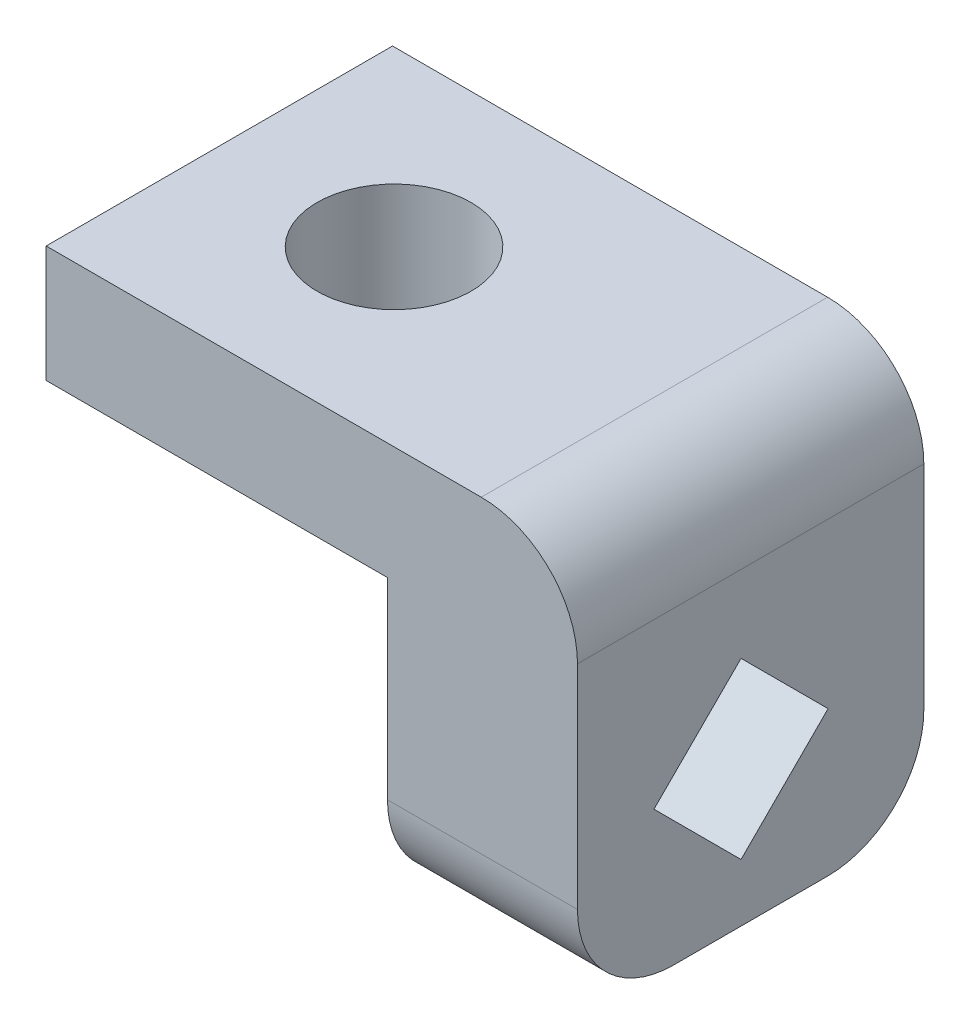
ISO-10303-21;
HEADER;
FILE_DESCRIPTION(('STEP AP214'),'2;1');
FILE_NAME('part.step','',(''),(''),'','','');
FILE_SCHEMA(('AUTOMOTIVE_DESIGN { 1 0 10303 214 1 1 1 1 }'));
ENDSEC;
DATA;
#1=APPLICATION_CONTEXT('core data for automotive mechanical design processes');
#2=APPLICATION_PROTOCOL_DEFINITION('international standard','automotive_design',2000,#1);
#3=PRODUCT_CONTEXT('',#1,'mechanical');
#4=PRODUCT('Part','Part','',(#3));
#5=PRODUCT_RELATED_PRODUCT_CATEGORY('part','',(#4));
#6=PRODUCT_DEFINITION_FORMATION('','',#4);
#7=PRODUCT_DEFINITION_CONTEXT('part definition',#1,'design');
#8=PRODUCT_DEFINITION('design','',#6,#7);
#9=PRODUCT_DEFINITION_SHAPE('','',#8);
#10=(LENGTH_UNIT() NAMED_UNIT(*) SI_UNIT(.MILLI.,.METRE.));
#11=(NAMED_UNIT(*) PLANE_ANGLE_UNIT() SI_UNIT($,.RADIAN.));
#12=(NAMED_UNIT(*) SI_UNIT($,.STERADIAN.) SOLID_ANGLE_UNIT());
#13=UNCERTAINTY_MEASURE_WITH_UNIT(LENGTH_MEASURE(1.E-05),#10,'distance_accuracy_value','');
#14=(GEOMETRIC_REPRESENTATION_CONTEXT(3) GLOBAL_UNCERTAINTY_ASSIGNED_CONTEXT((#13)) GLOBAL_UNIT_ASSIGNED_CONTEXT((#10,
#11,#12)) REPRESENTATION_CONTEXT('',''));
#15=CARTESIAN_POINT('',(0.,0.,0.));
#16=DIRECTION('',(0.,0.,1.));
#17=DIRECTION('',(1.,0.,0.));
#18=AXIS2_PLACEMENT_3D('',#15,#16,#17);
#19=CARTESIAN_POINT('',(0.,0.,-8.99999961256981));
#20=DIRECTION('',(0.,0.,-1.));
#21=DIRECTION('',(-1.,0.,0.));
#22=AXIS2_PLACEMENT_3D('',#19,#20,#21);
#23=PLANE('',#22);
#24=DIRECTION('',(0.,1.,0.));
#25=VECTOR('',#24,1.);
#26=CARTESIAN_POINT('',(4.93649998679757,18.9999993890524,-8.99999961256981));
#27=LINE('',#26,#25);
#28=CARTESIAN_POINT('',(4.93649998679757,23.9999993890524,-8.99999961256981));
#29=VERTEX_POINT('',#28);
#30=CARTESIAN_POINT('',(4.93649998679757,35.0550615325178,-8.99999961256981));
#31=VERTEX_POINT('',#30);
#32=EDGE_CURVE('E209',#29,#31,#27,.T.);
#33=ORIENTED_EDGE('',*,*,#32,.F.);
#34=DIRECTION('',(-1.,0.,0.));
#35=VECTOR('',#34,1.);
#36=CARTESIAN_POINT('',(0.,23.9999993890524,-8.99999961256981));
#37=LINE('',#36,#35);
#38=CARTESIAN_POINT('',(-4.93649998679757,23.9999993890524,-8.99999961256981));
#39=VERTEX_POINT('',#38);
#40=EDGE_CURVE('E12',#29,#39,#37,.T.);
#41=ORIENTED_EDGE('',*,*,#40,.T.);
#42=DIRECTION('',(0.,-1.,0.));
#43=VECTOR('',#42,1.);
#44=CARTESIAN_POINT('',(-4.93649998679757,37.0000004768372,-8.99999961256981));
#45=LINE('',#44,#43);
#46=CARTESIAN_POINT('',(-4.93649998679757,34.0000004768372,-8.99999961256981));
#47=VERTEX_POINT('',#46);
#48=EDGE_CURVE('E172',#47,#39,#45,.T.);
#49=ORIENTED_EDGE('',*,*,#48,.F.);
#50=DIRECTION('',(1.,0.,0.));
#51=VECTOR('',#50,1.);
#52=CARTESIAN_POINT('',(-22.6750001311302,34.0000004768372,-8.99999961256981));
#53=LINE('',#52,#51);
#54=CARTESIAN_POINT('',(-22.6750001311302,34.0000004768372,-8.99999961256981));
#55=VERTEX_POINT('',#54);
#56=EDGE_CURVE('E170',#55,#47,#53,.T.);
#57=ORIENTED_EDGE('',*,*,#56,.F.);
#58=DIRECTION('',(0.,1.,0.));
#59=VECTOR('',#58,1.);
#60=CARTESIAN_POINT('',(-22.6750001311302,37.0000004768372,-8.99999961256981));
#61=LINE('',#60,#59);
#62=CARTESIAN_POINT('',(-22.6750001311302,40.0550615325178,-8.99999961256981));
#63=VERTEX_POINT('',#62);
#64=EDGE_CURVE('E154',#55,#63,#61,.T.);
#65=ORIENTED_EDGE('',*,*,#64,.T.);
#66=DIRECTION('',(-1.,0.,0.));
#67=VECTOR('',#66,1.);
#68=CARTESIAN_POINT('',(0.,40.0550615325178,-8.99999961256981));
#69=LINE('',#68,#67);
#70=CARTESIAN_POINT('',(-0.0635000132024333,40.0550615325178,-8.99999961256981));
#71=VERTEX_POINT('',#70);
#72=EDGE_CURVE('E191',#71,#63,#69,.T.);
#73=ORIENTED_EDGE('',*,*,#72,.F.);
#74=CARTESIAN_POINT('',(-0.0635000132024333,35.0550615325178,-8.99999961256981));
#75=DIRECTION('',(0.,0.,-1.));
#76=DIRECTION('',(-1.,0.,0.));
#77=AXIS2_PLACEMENT_3D('',#74,#75,#76);
#78=CIRCLE('',#77,5.);
#79=EDGE_CURVE('E243',#71,#31,#78,.T.);
#80=ORIENTED_EDGE('',*,*,#79,.T.);
#81=EDGE_LOOP('',(#33,#41,#49,#57,#65,#73,#80));
#82=FACE_BOUND('',#81,.T.);
#83=ADVANCED_FACE('F58',(#82),#23,.T.);
#84=CARTESIAN_POINT('',(4.93649998679757,18.9999993890524,8.99999961256981));
#85=DIRECTION('',(-1.,0.,0.));
#86=DIRECTION('',(0.,0.,1.));
#87=AXIS2_PLACEMENT_3D('',#84,#85,#86);
#88=PLANE('',#87);
#89=DIRECTION('',(0.,0.707106703879505,0.707106858493582));
#90=VECTOR('',#89,1.);
#91=CARTESIAN_POINT('',(4.93649998679757,24.749999757318,3.25000050158373));
#92=LINE('',#91,#90);
#93=CARTESIAN_POINT('',(4.93649998679758,21.9999998807907,0.500000023748726));
#94=VERTEX_POINT('',#93);
#95=CARTESIAN_POINT('',(4.93649998679758,26.5254824771547,5.02548360964273));
#96=VERTEX_POINT('',#95);
#97=EDGE_CURVE('E232',#94,#96,#92,.T.);
#98=ORIENTED_EDGE('',*,*,#97,.T.);
#99=DIRECTION('',(0.,0.707106858493582,-0.707106703879504));
#100=VECTOR('',#99,1.);
#101=CARTESIAN_POINT('',(4.93649998679757,20.775482108889,10.7754827206288));
#102=LINE('',#101,#100);
#103=CARTESIAN_POINT('',(4.93649998679758,31.0509669943714,0.500000081956279));
#104=VERTEX_POINT('',#103);
#105=EDGE_CURVE('E235',#96,#104,#102,.T.);
#106=ORIENTED_EDGE('',*,*,#105,.T.);
#107=DIRECTION('',(0.,-0.707106703879504,-0.707106858493582));
#108=VECTOR('',#107,1.);
#109=CARTESIAN_POINT('',(4.93649998679757,29.2754842745347,-1.27548302610271));
#110=LINE('',#109,#108);
#111=CARTESIAN_POINT('',(4.93649998679757,26.5254843980074,-4.02548350393772));
#112=VERTEX_POINT('',#111);
#113=EDGE_CURVE('E166',#104,#112,#110,.T.);
#114=ORIENTED_EDGE('',*,*,#113,.T.);
#115=DIRECTION('',(0.,-0.707106858493582,0.707106703879504));
#116=VECTOR('',#115,1.);
#117=CARTESIAN_POINT('',(4.93649998679757,16.2499995125251,6.2499991347348));
#118=LINE('',#117,#116);
#119=EDGE_CURVE('E229',#112,#94,#118,.T.);
#120=ORIENTED_EDGE('',*,*,#119,.T.);
#121=EDGE_LOOP('',(#98,#106,#114,#120));
#122=FACE_BOUND('',#121,.T.);
#123=DIRECTION('',(0.,1.,0.));
#124=VECTOR('',#123,1.);
#125=CARTESIAN_POINT('',(4.93649998679757,18.9999993890524,8.99999961256981));
#126=LINE('',#125,#124);
#127=CARTESIAN_POINT('',(4.93649998679757,23.9999993890524,8.99999961256981));
#128=VERTEX_POINT('',#127);
#129=CARTESIAN_POINT('',(4.93649998679757,35.0550615325178,8.99999961256981));
#130=VERTEX_POINT('',#129);
#131=EDGE_CURVE('E216',#128,#130,#126,.T.);
#132=ORIENTED_EDGE('',*,*,#131,.F.);
#133=CARTESIAN_POINT('',(4.93649998679757,23.9999993890524,3.99999961256981));
#134=DIRECTION('',(-1.,0.,0.));
#135=DIRECTION('',(0.,0.,1.));
#136=AXIS2_PLACEMENT_3D('',#133,#134,#135);
#137=CIRCLE('',#136,5.);
#138=CARTESIAN_POINT('',(4.93649998679757,18.9999993890524,3.99999961256981));
#139=VERTEX_POINT('',#138);
#140=EDGE_CURVE('E256',#128,#139,#137,.F.);
#141=ORIENTED_EDGE('',*,*,#140,.T.);
#142=DIRECTION('',(0.,0.,-1.));
#143=VECTOR('',#142,1.);
#144=CARTESIAN_POINT('',(4.93649998679757,18.9999993890524,8.99999961256981));
#145=LINE('',#144,#143);
#146=CARTESIAN_POINT('',(4.93649998679757,18.9999993890524,-3.99999961256981));
#147=VERTEX_POINT('',#146);
#148=EDGE_CURVE('E218',#139,#147,#145,.T.);
#149=ORIENTED_EDGE('',*,*,#148,.T.);
#150=CARTESIAN_POINT('',(4.93649998679757,23.9999993890524,-3.99999961256981));
#151=DIRECTION('',(-1.,0.,0.));
#152=DIRECTION('',(0.,0.,1.));
#153=AXIS2_PLACEMENT_3D('',#150,#151,#152);
#154=CIRCLE('',#153,5.);
#155=EDGE_CURVE('E254',#147,#29,#154,.F.);
#156=ORIENTED_EDGE('',*,*,#155,.T.);
#157=ORIENTED_EDGE('',*,*,#32,.T.);
#158=DIRECTION('',(0.,0.,-1.));
#159=VECTOR('',#158,1.);
#160=CARTESIAN_POINT('',(4.93649998679757,35.0550615325178,8.99999961256981));
#161=LINE('',#160,#159);
#162=EDGE_CURVE('E246',#31,#130,#161,.F.);
#163=ORIENTED_EDGE('',*,*,#162,.T.);
#164=EDGE_LOOP('',(#132,#141,#149,#156,#157,#163));
#165=FACE_BOUND('',#164,.T.);
#166=ADVANCED_FACE('F274',(#122,#165),#88,.F.);
#167=CARTESIAN_POINT('',(0.,0.,8.99999961256981));
#168=DIRECTION('',(0.,0.,-1.));
#169=DIRECTION('',(-1.,0.,0.));
#170=AXIS2_PLACEMENT_3D('',#167,#168,#169);
#171=PLANE('',#170);
#172=DIRECTION('',(0.,-1.,0.));
#173=VECTOR('',#172,1.);
#174=CARTESIAN_POINT('',(-4.93649998679757,37.0000004768372,8.99999961256981));
#175=LINE('',#174,#173);
#176=CARTESIAN_POINT('',(-4.93649998679757,34.0000004768372,8.99999961256981));
#177=VERTEX_POINT('',#176);
#178=CARTESIAN_POINT('',(-4.93649998679757,23.9999993890524,8.99999961256981));
#179=VERTEX_POINT('',#178);
#180=EDGE_CURVE('E222',#177,#179,#175,.T.);
#181=ORIENTED_EDGE('',*,*,#180,.T.);
#182=DIRECTION('',(1.,0.,0.));
#183=VECTOR('',#182,1.);
#184=CARTESIAN_POINT('',(4.93649998679757,23.9999993890524,8.99999961256981));
#185=LINE('',#184,#183);
#186=EDGE_CURVE('E251',#179,#128,#185,.T.);
#187=ORIENTED_EDGE('',*,*,#186,.T.);
#188=ORIENTED_EDGE('',*,*,#131,.T.);
#189=CARTESIAN_POINT('',(-0.0635000132024333,35.0550615325178,8.99999961256981));
#190=DIRECTION('',(0.,0.,-1.));
#191=DIRECTION('',(-1.,0.,0.));
#192=AXIS2_PLACEMENT_3D('',#189,#190,#191);
#193=CIRCLE('',#192,5.);
#194=CARTESIAN_POINT('',(-0.0635000132024333,40.0550615325178,8.99999961256981));
#195=VERTEX_POINT('',#194);
#196=EDGE_CURVE('E249',#130,#195,#193,.F.);
#197=ORIENTED_EDGE('',*,*,#196,.T.);
#198=DIRECTION('',(-1.,0.,0.));
#199=VECTOR('',#198,1.);
#200=CARTESIAN_POINT('',(0.,40.0550615325178,8.99999961256981));
#201=LINE('',#200,#199);
#202=CARTESIAN_POINT('',(-22.6750001311302,40.0550615325178,8.99999961256981));
#203=VERTEX_POINT('',#202);
#204=EDGE_CURVE('E238',#195,#203,#201,.T.);
#205=ORIENTED_EDGE('',*,*,#204,.T.);
#206=DIRECTION('',(0.,-1.,0.));
#207=VECTOR('',#206,1.);
#208=CARTESIAN_POINT('',(-22.6750001311302,0.,8.99999961256981));
#209=LINE('',#208,#207);
#210=CARTESIAN_POINT('',(-22.6750001311302,34.0000004768372,8.99999961256981));
#211=VERTEX_POINT('',#210);
#212=EDGE_CURVE('E193',#203,#211,#209,.T.);
#213=ORIENTED_EDGE('',*,*,#212,.T.);
#214=DIRECTION('',(-1.,0.,0.));
#215=VECTOR('',#214,1.);
#216=CARTESIAN_POINT('',(-4.93649998679757,34.0000004768372,8.99999961256981));
#217=LINE('',#216,#215);
#218=EDGE_CURVE('E179',#177,#211,#217,.T.);
#219=ORIENTED_EDGE('',*,*,#218,.F.);
#220=EDGE_LOOP('',(#181,#187,#188,#197,#205,#213,#219));
#221=FACE_BOUND('',#220,.T.);
#222=ADVANCED_FACE('F269',(#221),#171,.F.);
#223=CARTESIAN_POINT('',(118.674999475479,40.0550615325178,-22.8594064091749));
#224=DIRECTION('',(0.,-1.,0.));
#225=DIRECTION('',(0.,0.,-1.));
#226=AXIS2_PLACEMENT_3D('',#223,#224,#225);
#227=PLANE('',#226);
#228=CARTESIAN_POINT('',(-13.5955331401277,40.0550615325178,0.));
#229=DIRECTION('',(0.,-1.,0.));
#230=DIRECTION('',(0.,0.,-1.));
#231=AXIS2_PLACEMENT_3D('',#228,#229,#230);
#232=CIRCLE('',#231,4.);
#233=CARTESIAN_POINT('',(-13.5955331401277,40.0550615325178,-4.));
#234=VERTEX_POINT('',#233);
#235=EDGE_CURVE('E187',#234,#234,#232,.T.);
#236=ORIENTED_EDGE('',*,*,#235,.T.);
#237=EDGE_LOOP('',(#236));
#238=FACE_BOUND('',#237,.T.);
#239=ORIENTED_EDGE('',*,*,#204,.F.);
#240=DIRECTION('',(0.,0.,-1.));
#241=VECTOR('',#240,1.);
#242=CARTESIAN_POINT('',(-0.0635000132024333,40.0550615325178,-22.8594064091749));
#243=LINE('',#242,#241);
#244=EDGE_CURVE('E240',#195,#71,#243,.T.);
#245=ORIENTED_EDGE('',*,*,#244,.T.);
#246=ORIENTED_EDGE('',*,*,#72,.T.);
#247=DIRECTION('',(0.,0.,1.));
#248=VECTOR('',#247,1.);
#249=CARTESIAN_POINT('',(-22.6750001311302,40.0550615325178,0.));
#250=LINE('',#249,#248);
#251=EDGE_CURVE('E162',#63,#203,#250,.T.);
#252=ORIENTED_EDGE('',*,*,#251,.T.);
#253=EDGE_LOOP('',(#239,#245,#246,#252));
#254=FACE_BOUND('',#253,.T.);
#255=ADVANCED_FACE('F285',(#238,#254),#227,.F.);
#256=CARTESIAN_POINT('',(-22.6750001311302,0.,0.));
#257=DIRECTION('',(-1.,0.,0.));
#258=DIRECTION('',(0.,0.,1.));
#259=AXIS2_PLACEMENT_3D('',#256,#257,#258);
#260=PLANE('',#259);
#261=ORIENTED_EDGE('',*,*,#251,.F.);
#262=ORIENTED_EDGE('',*,*,#64,.F.);
#263=DIRECTION('',(0.,0.,-1.));
#264=VECTOR('',#263,1.);
#265=CARTESIAN_POINT('',(-22.6750001311302,34.0000004768372,8.99999961256981));
#266=LINE('',#265,#264);
#267=EDGE_CURVE('E159',#211,#55,#266,.T.);
#268=ORIENTED_EDGE('',*,*,#267,.F.);
#269=ORIENTED_EDGE('',*,*,#212,.F.);
#270=EDGE_LOOP('',(#261,#262,#268,#269));
#271=FACE_BOUND('',#270,.T.);
#272=ADVANCED_FACE('F156',(#271),#260,.T.);
#273=CARTESIAN_POINT('',(0.,18.9999993890524,0.));
#274=DIRECTION('',(0.,-1.,0.));
#275=DIRECTION('',(0.,0.,-1.));
#276=AXIS2_PLACEMENT_3D('',#273,#274,#275);
#277=PLANE('',#276);
#278=ORIENTED_EDGE('',*,*,#148,.F.);
#279=DIRECTION('',(1.,0.,0.));
#280=VECTOR('',#279,1.);
#281=CARTESIAN_POINT('',(-4.93649998679757,18.9999993890524,3.99999961256981));
#282=LINE('',#281,#280);
#283=CARTESIAN_POINT('',(-4.93649998679757,18.9999993890524,3.99999961256981));
#284=VERTEX_POINT('',#283);
#285=EDGE_CURVE('E260',#139,#284,#282,.F.);
#286=ORIENTED_EDGE('',*,*,#285,.T.);
#287=DIRECTION('',(0.,0.,-1.));
#288=VECTOR('',#287,1.);
#289=CARTESIAN_POINT('',(-4.93649998679757,18.9999993890524,8.99999961256981));
#290=LINE('',#289,#288);
#291=CARTESIAN_POINT('',(-4.93649998679757,18.9999993890524,-3.99999961256981));
#292=VERTEX_POINT('',#291);
#293=EDGE_CURVE('E167',#284,#292,#290,.T.);
#294=ORIENTED_EDGE('',*,*,#293,.T.);
#295=DIRECTION('',(-1.,0.,0.));
#296=VECTOR('',#295,1.);
#297=CARTESIAN_POINT('',(0.,18.9999993890524,-3.99999961256981));
#298=LINE('',#297,#296);
#299=EDGE_CURVE('E258',#292,#147,#298,.F.);
#300=ORIENTED_EDGE('',*,*,#299,.T.);
#301=EDGE_LOOP('',(#278,#286,#294,#300));
#302=FACE_BOUND('',#301,.T.);
#303=ADVANCED_FACE('F277',(#302),#277,.T.);
#304=CARTESIAN_POINT('',(-4.93649998679757,37.0000004768372,8.99999961256981));
#305=DIRECTION('',(1.,0.,0.));
#306=DIRECTION('',(0.,1.,0.));
#307=AXIS2_PLACEMENT_3D('',#304,#305,#306);
#308=PLANE('',#307);
#309=DIRECTION('',(0.,-0.707106703879504,-0.707106858493582));
#310=VECTOR('',#309,1.);
#311=CARTESIAN_POINT('',(-4.93649998679757,31.0509669943714,0.500000081956279));
#312=LINE('',#311,#310);
#313=CARTESIAN_POINT('',(-4.93649998679757,31.0509669943714,0.500000081956278));
#314=VERTEX_POINT('',#313);
#315=CARTESIAN_POINT('',(-4.93649998679757,26.5254843980074,-4.02548350393772));
#316=VERTEX_POINT('',#315);
#317=EDGE_CURVE('E197',#314,#316,#312,.T.);
#318=ORIENTED_EDGE('',*,*,#317,.F.);
#319=DIRECTION('',(0.,0.707106858493582,-0.707106703879504));
#320=VECTOR('',#319,1.);
#321=CARTESIAN_POINT('',(-4.93649998679757,26.5254824771547,5.02548360964273));
#322=LINE('',#321,#320);
#323=CARTESIAN_POINT('',(-4.93649998679757,26.5254824771547,5.02548360964273));
#324=VERTEX_POINT('',#323);
#325=EDGE_CURVE('E195',#324,#314,#322,.T.);
#326=ORIENTED_EDGE('',*,*,#325,.F.);
#327=DIRECTION('',(0.,0.707106703879504,0.707106858493582));
#328=VECTOR('',#327,1.);
#329=CARTESIAN_POINT('',(-4.93649998679757,21.9999998807907,0.500000023748726));
#330=LINE('',#329,#328);
#331=CARTESIAN_POINT('',(-4.93649998679757,21.9999998807907,0.500000023748726));
#332=VERTEX_POINT('',#331);
#333=EDGE_CURVE('E203',#332,#324,#330,.T.);
#334=ORIENTED_EDGE('',*,*,#333,.F.);
#335=DIRECTION('',(0.,-0.707106858493582,0.707106703879504));
#336=VECTOR('',#335,1.);
#337=CARTESIAN_POINT('',(-4.93649998679757,26.5254843980074,-4.02548350393772));
#338=LINE('',#337,#336);
#339=EDGE_CURVE('E200',#316,#332,#338,.T.);
#340=ORIENTED_EDGE('',*,*,#339,.F.);
#341=EDGE_LOOP('',(#318,#326,#334,#340));
#342=FACE_BOUND('',#341,.T.);
#343=ORIENTED_EDGE('',*,*,#293,.F.);
#344=CARTESIAN_POINT('',(-4.93649998679757,23.9999993890524,3.99999961256981));
#345=DIRECTION('',(1.,0.,0.));
#346=DIRECTION('',(0.,1.,0.));
#347=AXIS2_PLACEMENT_3D('',#344,#345,#346);
#348=CIRCLE('',#347,5.);
#349=EDGE_CURVE('E66',#284,#179,#348,.F.);
#350=ORIENTED_EDGE('',*,*,#349,.T.);
#351=ORIENTED_EDGE('',*,*,#180,.F.);
#352=DIRECTION('',(0.,0.,1.));
#353=VECTOR('',#352,1.);
#354=CARTESIAN_POINT('',(-4.93649998679757,34.0000004768372,-8.99999961256981));
#355=LINE('',#354,#353);
#356=EDGE_CURVE('E175',#47,#177,#355,.T.);
#357=ORIENTED_EDGE('',*,*,#356,.F.);
#358=ORIENTED_EDGE('',*,*,#48,.T.);
#359=CARTESIAN_POINT('',(-4.93649998679757,23.9999993890524,-3.99999961256981));
#360=DIRECTION('',(1.,0.,0.));
#361=DIRECTION('',(0.,1.,0.));
#362=AXIS2_PLACEMENT_3D('',#359,#360,#361);
#363=CIRCLE('',#362,5.);
#364=EDGE_CURVE('E73',#39,#292,#363,.F.);
#365=ORIENTED_EDGE('',*,*,#364,.T.);
#366=EDGE_LOOP('',(#343,#350,#351,#357,#358,#365));
#367=FACE_BOUND('',#366,.T.);
#368=ADVANCED_FACE('F264',(#342,#367),#308,.F.);
#369=CARTESIAN_POINT('',(22.6750001311302,26.5254824771547,5.02548360964273));
#370=DIRECTION('',(0.,0.707106703879504,0.707106858493582));
#371=DIRECTION('',(0.,-0.707106858493582,0.707106703879504));
#372=AXIS2_PLACEMENT_3D('',#369,#370,#371);
#373=PLANE('',#372);
#374=DIRECTION('',(-1.,0.,0.));
#375=VECTOR('',#374,1.);
#376=CARTESIAN_POINT('',(22.6750001311302,26.5254824771547,5.02548360964273));
#377=LINE('',#376,#375);
#378=EDGE_CURVE('E207',#96,#324,#377,.T.);
#379=ORIENTED_EDGE('',*,*,#378,.T.);
#380=ORIENTED_EDGE('',*,*,#325,.T.);
#381=DIRECTION('',(-1.,0.,0.));
#382=VECTOR('',#381,1.);
#383=CARTESIAN_POINT('',(22.6750001311302,31.0509669943714,0.500000081956279));
#384=LINE('',#383,#382);
#385=EDGE_CURVE('E206',#104,#314,#384,.T.);
#386=ORIENTED_EDGE('',*,*,#385,.F.);
#387=ORIENTED_EDGE('',*,*,#105,.F.);
#388=EDGE_LOOP('',(#379,#380,#386,#387));
#389=FACE_BOUND('',#388,.T.);
#390=ADVANCED_FACE('F372',(#389),#373,.F.);
#391=CARTESIAN_POINT('',(22.6750001311302,21.9999998807907,0.500000023748726));
#392=DIRECTION('',(0.,-0.707106858493582,0.707106703879504));
#393=DIRECTION('',(0.,-0.707106703879505,-0.707106858493582));
#394=AXIS2_PLACEMENT_3D('',#391,#392,#393);
#395=PLANE('',#394);
#396=DIRECTION('',(-1.,0.,0.));
#397=VECTOR('',#396,1.);
#398=CARTESIAN_POINT('',(22.6750001311302,21.9999998807907,0.500000023748726));
#399=LINE('',#398,#397);
#400=EDGE_CURVE('E210',#94,#332,#399,.T.);
#401=ORIENTED_EDGE('',*,*,#400,.T.);
#402=ORIENTED_EDGE('',*,*,#333,.T.);
#403=ORIENTED_EDGE('',*,*,#378,.F.);
#404=ORIENTED_EDGE('',*,*,#97,.F.);
#405=EDGE_LOOP('',(#401,#402,#403,#404));
#406=FACE_BOUND('',#405,.T.);
#407=ADVANCED_FACE('F385',(#406),#395,.F.);
#408=CARTESIAN_POINT('',(22.6750001311302,26.5254843980074,-4.02548350393772));
#409=DIRECTION('',(0.,-0.707106703879504,-0.707106858493582));
#410=DIRECTION('',(0.,0.707106858493582,-0.707106703879504));
#411=AXIS2_PLACEMENT_3D('',#408,#409,#410);
#412=PLANE('',#411);
#413=DIRECTION('',(-1.,0.,0.));
#414=VECTOR('',#413,1.);
#415=CARTESIAN_POINT('',(22.6750001311302,26.5254843980074,-4.02548350393772));
#416=LINE('',#415,#414);
#417=EDGE_CURVE('E212',#112,#316,#416,.T.);
#418=ORIENTED_EDGE('',*,*,#417,.T.);
#419=ORIENTED_EDGE('',*,*,#339,.T.);
#420=ORIENTED_EDGE('',*,*,#400,.F.);
#421=ORIENTED_EDGE('',*,*,#119,.F.);
#422=EDGE_LOOP('',(#418,#419,#420,#421));
#423=FACE_BOUND('',#422,.T.);
#424=ADVANCED_FACE('F395',(#423),#412,.F.);
#425=CARTESIAN_POINT('',(22.6750001311302,31.0509669943714,0.500000081956279));
#426=DIRECTION('',(0.,0.707106858493582,-0.707106703879504));
#427=DIRECTION('',(0.,0.707106703879504,0.707106858493582));
#428=AXIS2_PLACEMENT_3D('',#425,#426,#427);
#429=PLANE('',#428);
#430=ORIENTED_EDGE('',*,*,#385,.T.);
#431=ORIENTED_EDGE('',*,*,#317,.T.);
#432=ORIENTED_EDGE('',*,*,#417,.F.);
#433=ORIENTED_EDGE('',*,*,#113,.F.);
#434=EDGE_LOOP('',(#430,#431,#432,#433));
#435=FACE_BOUND('',#434,.T.);
#436=ADVANCED_FACE('F405',(#435),#429,.F.);
#437=CARTESIAN_POINT('',(-13.5955331401277,50.0000004768372,0.));
#438=DIRECTION('',(0.,-1.,0.));
#439=DIRECTION('',(0.,0.,-1.));
#440=AXIS2_PLACEMENT_3D('',#437,#438,#439);
#441=CYLINDRICAL_SURFACE('',#440,4.);
#442=ORIENTED_EDGE('',*,*,#235,.F.);
#443=EDGE_LOOP('',(#442));
#444=FACE_BOUND('',#443,.T.);
#445=CARTESIAN_POINT('',(-13.5955331401277,34.0000004768372,0.));
#446=DIRECTION('',(0.,-1.,0.));
#447=DIRECTION('',(0.,0.,-1.));
#448=AXIS2_PLACEMENT_3D('',#445,#446,#447);
#449=CIRCLE('',#448,4.);
#450=CARTESIAN_POINT('',(-13.5955331401277,34.0000004768372,-4.));
#451=VERTEX_POINT('',#450);
#452=EDGE_CURVE('E180',#451,#451,#449,.T.);
#453=ORIENTED_EDGE('',*,*,#452,.T.);
#454=EDGE_LOOP('',(#453));
#455=FACE_BOUND('',#454,.T.);
#456=ADVANCED_FACE('F415',(#444,#455),#441,.F.);
#457=CARTESIAN_POINT('',(0.,34.0000004768372,0.));
#458=DIRECTION('',(0.,-1.,0.));
#459=DIRECTION('',(0.,0.,-1.));
#460=AXIS2_PLACEMENT_3D('',#457,#458,#459);
#461=PLANE('',#460);
#462=ORIENTED_EDGE('',*,*,#452,.F.);
#463=EDGE_LOOP('',(#462));
#464=FACE_BOUND('',#463,.T.);
#465=ORIENTED_EDGE('',*,*,#267,.T.);
#466=ORIENTED_EDGE('',*,*,#56,.T.);
#467=ORIENTED_EDGE('',*,*,#356,.T.);
#468=ORIENTED_EDGE('',*,*,#218,.T.);
#469=EDGE_LOOP('',(#465,#466,#467,#468));
#470=FACE_BOUND('',#469,.T.);
#471=ADVANCED_FACE('F177',(#464,#470),#461,.T.);
#472=CARTESIAN_POINT('',(-0.0635000132024333,35.0550615325178,-22.8594064091749));
#473=DIRECTION('',(0.,0.,-1.));
#474=DIRECTION('',(-1.,0.,0.));
#475=AXIS2_PLACEMENT_3D('',#472,#473,#474);
#476=CYLINDRICAL_SURFACE('',#475,5.);
#477=ORIENTED_EDGE('',*,*,#196,.F.);
#478=ORIENTED_EDGE('',*,*,#162,.F.);
#479=ORIENTED_EDGE('',*,*,#79,.F.);
#480=ORIENTED_EDGE('',*,*,#244,.F.);
#481=EDGE_LOOP('',(#477,#478,#479,#480));
#482=FACE_BOUND('',#481,.T.);
#483=ADVANCED_FACE('F282',(#482),#476,.T.);
#484=CARTESIAN_POINT('',(0.,23.9999993890524,3.99999961256981));
#485=DIRECTION('',(-1.,0.,0.));
#486=DIRECTION('',(0.,0.,1.));
#487=AXIS2_PLACEMENT_3D('',#484,#485,#486);
#488=CYLINDRICAL_SURFACE('',#487,5.);
#489=ORIENTED_EDGE('',*,*,#349,.F.);
#490=ORIENTED_EDGE('',*,*,#285,.F.);
#491=ORIENTED_EDGE('',*,*,#140,.F.);
#492=ORIENTED_EDGE('',*,*,#186,.F.);
#493=EDGE_LOOP('',(#489,#490,#491,#492));
#494=FACE_BOUND('',#493,.T.);
#495=ADVANCED_FACE('F271',(#494),#488,.T.);
#496=CARTESIAN_POINT('',(0.,23.9999993890524,-3.99999961256981));
#497=DIRECTION('',(-1.,0.,0.));
#498=DIRECTION('',(0.,0.,1.));
#499=AXIS2_PLACEMENT_3D('',#496,#497,#498);
#500=CYLINDRICAL_SURFACE('',#499,5.);
#501=ORIENTED_EDGE('',*,*,#155,.F.);
#502=ORIENTED_EDGE('',*,*,#299,.F.);
#503=ORIENTED_EDGE('',*,*,#364,.F.);
#504=ORIENTED_EDGE('',*,*,#40,.F.);
#505=EDGE_LOOP('',(#501,#502,#503,#504));
#506=FACE_BOUND('',#505,.T.);
#507=ADVANCED_FACE('F60',(#506),#500,.T.);
#508=CLOSED_SHELL('',(#83,#166,#222,#255,#272,#303,#368,#390,#407,#424,#436,#456,#471,#483,#495,#507));
#509=MANIFOLD_SOLID_BREP('B2',#508);
#510=ADVANCED_BREP_SHAPE_REPRESENTATION('',(#18,#509),#14);
#511=SHAPE_DEFINITION_REPRESENTATION(#9,#510);
ENDSEC;
END-ISO-10303-21;
